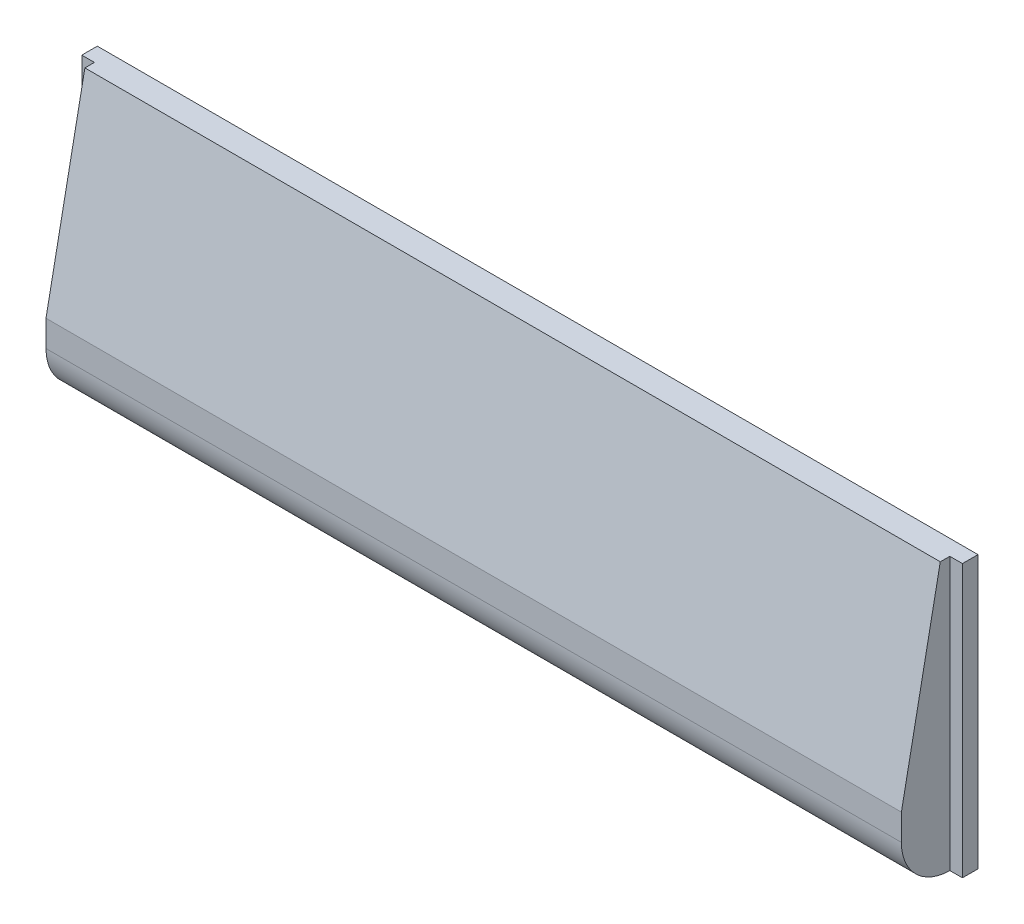
ISO-10303-21;
HEADER;
FILE_DESCRIPTION(('STEP AP214'),'2;1');
FILE_NAME('part.step','',(''),(''),'','','');
FILE_SCHEMA(('AUTOMOTIVE_DESIGN { 1 0 10303 214 1 1 1 1 }'));
ENDSEC;
DATA;
#1=APPLICATION_CONTEXT('core data for automotive mechanical design processes');
#2=APPLICATION_PROTOCOL_DEFINITION('international standard','automotive_design',2000,#1);
#3=PRODUCT_CONTEXT('',#1,'mechanical');
#4=PRODUCT('Part','Part','',(#3));
#5=PRODUCT_RELATED_PRODUCT_CATEGORY('part','',(#4));
#6=PRODUCT_DEFINITION_FORMATION('','',#4);
#7=PRODUCT_DEFINITION_CONTEXT('part definition',#1,'design');
#8=PRODUCT_DEFINITION('design','',#6,#7);
#9=PRODUCT_DEFINITION_SHAPE('','',#8);
#10=(LENGTH_UNIT() NAMED_UNIT(*) SI_UNIT(.MILLI.,.METRE.));
#11=(NAMED_UNIT(*) PLANE_ANGLE_UNIT() SI_UNIT($,.RADIAN.));
#12=(NAMED_UNIT(*) SI_UNIT($,.STERADIAN.) SOLID_ANGLE_UNIT());
#13=UNCERTAINTY_MEASURE_WITH_UNIT(LENGTH_MEASURE(1.E-05),#10,'distance_accuracy_value','');
#14=(GEOMETRIC_REPRESENTATION_CONTEXT(3) GLOBAL_UNCERTAINTY_ASSIGNED_CONTEXT((#13)) GLOBAL_UNIT_ASSIGNED_CONTEXT((#10,
#11,#12)) REPRESENTATION_CONTEXT('',''));
#15=CARTESIAN_POINT('',(0.,0.,0.));
#16=DIRECTION('',(0.,0.,1.));
#17=DIRECTION('',(1.,0.,0.));
#18=AXIS2_PLACEMENT_3D('',#15,#16,#17);
#19=CARTESIAN_POINT('',(-22.65,7.,0.8));
#20=DIRECTION('',(0.,-1.,0.));
#21=DIRECTION('',(0.,0.,-1.));
#22=AXIS2_PLACEMENT_3D('',#19,#20,#21);
#23=PLANE('',#22);
#24=DIRECTION('',(-1.,0.,0.));
#25=VECTOR('',#24,1.);
#26=CARTESIAN_POINT('',(35.,7.,1.29));
#27=LINE('',#26,#25);
#28=CARTESIAN_POINT('',(22.,7.,1.29));
#29=VERTEX_POINT('',#28);
#30=CARTESIAN_POINT('',(-22.,7.,1.29));
#31=VERTEX_POINT('',#30);
#32=EDGE_CURVE('E134',#29,#31,#27,.T.);
#33=ORIENTED_EDGE('',*,*,#32,.F.);
#34=DIRECTION('',(0.,0.,-1.));
#35=VECTOR('',#34,1.);
#36=CARTESIAN_POINT('',(22.,7.,5.8));
#37=LINE('',#36,#35);
#38=CARTESIAN_POINT('',(22.,7.,0.8));
#39=VERTEX_POINT('',#38);
#40=EDGE_CURVE('E148',#29,#39,#37,.T.);
#41=ORIENTED_EDGE('',*,*,#40,.T.);
#42=DIRECTION('',(-1.,0.,0.));
#43=VECTOR('',#42,1.);
#44=CARTESIAN_POINT('',(-22.65,7.,0.8));
#45=LINE('',#44,#43);
#46=CARTESIAN_POINT('',(22.65,7.,0.8));
#47=VERTEX_POINT('',#46);
#48=EDGE_CURVE('E156',#47,#39,#45,.T.);
#49=ORIENTED_EDGE('',*,*,#48,.F.);
#50=DIRECTION('',(0.,0.,-1.));
#51=VECTOR('',#50,1.);
#52=CARTESIAN_POINT('',(22.65,7.,0.8));
#53=LINE('',#52,#51);
#54=CARTESIAN_POINT('',(22.65,7.,0.));
#55=VERTEX_POINT('',#54);
#56=EDGE_CURVE('E11',#47,#55,#53,.T.);
#57=ORIENTED_EDGE('',*,*,#56,.T.);
#58=DIRECTION('',(-1.,0.,0.));
#59=VECTOR('',#58,1.);
#60=CARTESIAN_POINT('',(-22.65,7.,0.));
#61=LINE('',#60,#59);
#62=CARTESIAN_POINT('',(-22.65,7.,0.));
#63=VERTEX_POINT('',#62);
#64=EDGE_CURVE('E168',#55,#63,#61,.T.);
#65=ORIENTED_EDGE('',*,*,#64,.T.);
#66=DIRECTION('',(0.,0.,-1.));
#67=VECTOR('',#66,1.);
#68=CARTESIAN_POINT('',(-22.65,7.,0.8));
#69=LINE('',#68,#67);
#70=CARTESIAN_POINT('',(-22.65,7.,0.8));
#71=VERTEX_POINT('',#70);
#72=EDGE_CURVE('E47',#71,#63,#69,.T.);
#73=ORIENTED_EDGE('',*,*,#72,.F.);
#74=CARTESIAN_POINT('',(-22.,7.,0.8));
#75=VERTEX_POINT('',#74);
#76=EDGE_CURVE('E154',#75,#71,#45,.T.);
#77=ORIENTED_EDGE('',*,*,#76,.F.);
#78=DIRECTION('',(0.,0.,-1.));
#79=VECTOR('',#78,1.);
#80=CARTESIAN_POINT('',(-22.,7.,5.8));
#81=LINE('',#80,#79);
#82=EDGE_CURVE('E61',#31,#75,#81,.T.);
#83=ORIENTED_EDGE('',*,*,#82,.F.);
#84=EDGE_LOOP('',(#33,#41,#49,#57,#65,#73,#77,#83));
#85=FACE_BOUND('',#84,.T.);
#86=ADVANCED_FACE('F39',(#85),#23,.F.);
#87=CARTESIAN_POINT('',(0.,0.,0.8));
#88=DIRECTION('',(0.,0.,-1.));
#89=DIRECTION('',(-1.,0.,0.));
#90=AXIS2_PLACEMENT_3D('',#87,#88,#89);
#91=PLANE('',#90);
#92=DIRECTION('',(0.,1.,0.));
#93=VECTOR('',#92,1.);
#94=CARTESIAN_POINT('',(22.,-7.,0.8));
#95=LINE('',#94,#93);
#96=CARTESIAN_POINT('',(22.,-7.,0.8));
#97=VERTEX_POINT('',#96);
#98=EDGE_CURVE('E143',#97,#39,#95,.T.);
#99=ORIENTED_EDGE('',*,*,#98,.F.);
#100=DIRECTION('',(1.,0.,0.));
#101=VECTOR('',#100,1.);
#102=CARTESIAN_POINT('',(-22.65,-7.,0.8));
#103=LINE('',#102,#101);
#104=CARTESIAN_POINT('',(22.65,-7.,0.8));
#105=VERTEX_POINT('',#104);
#106=EDGE_CURVE('E161',#97,#105,#103,.T.);
#107=ORIENTED_EDGE('',*,*,#106,.T.);
#108=DIRECTION('',(0.,1.,0.));
#109=VECTOR('',#108,1.);
#110=CARTESIAN_POINT('',(22.65,-7.,0.8));
#111=LINE('',#110,#109);
#112=EDGE_CURVE('E151',#105,#47,#111,.T.);
#113=ORIENTED_EDGE('',*,*,#112,.T.);
#114=ORIENTED_EDGE('',*,*,#48,.T.);
#115=EDGE_LOOP('',(#99,#107,#113,#114));
#116=FACE_BOUND('',#115,.T.);
#117=ADVANCED_FACE('F200',(#116),#91,.F.);
#118=DIRECTION('',(0.,-1.,0.));
#119=VECTOR('',#118,1.);
#120=CARTESIAN_POINT('',(-22.,-7.,0.8));
#121=LINE('',#120,#119);
#122=CARTESIAN_POINT('',(-22.,-7.,0.8));
#123=VERTEX_POINT('',#122);
#124=EDGE_CURVE('E129',#75,#123,#121,.T.);
#125=ORIENTED_EDGE('',*,*,#124,.F.);
#126=ORIENTED_EDGE('',*,*,#76,.T.);
#127=DIRECTION('',(0.,-1.,0.));
#128=VECTOR('',#127,1.);
#129=CARTESIAN_POINT('',(-22.65,-7.,0.8));
#130=LINE('',#129,#128);
#131=CARTESIAN_POINT('',(-22.65,-7.,0.8));
#132=VERTEX_POINT('',#131);
#133=EDGE_CURVE('E159',#71,#132,#130,.T.);
#134=ORIENTED_EDGE('',*,*,#133,.T.);
#135=EDGE_CURVE('E162',#132,#123,#103,.T.);
#136=ORIENTED_EDGE('',*,*,#135,.T.);
#137=EDGE_LOOP('',(#125,#126,#134,#136));
#138=FACE_BOUND('',#137,.T.);
#139=ADVANCED_FACE('F202',(#138),#91,.F.);
#140=CARTESIAN_POINT('',(22.65,-7.,0.8));
#141=DIRECTION('',(-1.,0.,0.));
#142=DIRECTION('',(0.,0.,1.));
#143=AXIS2_PLACEMENT_3D('',#140,#141,#142);
#144=PLANE('',#143);
#145=DIRECTION('',(0.,1.,0.));
#146=VECTOR('',#145,1.);
#147=CARTESIAN_POINT('',(22.65,-7.,0.));
#148=LINE('',#147,#146);
#149=CARTESIAN_POINT('',(22.65,-7.,0.));
#150=VERTEX_POINT('',#149);
#151=EDGE_CURVE('E150',#150,#55,#148,.T.);
#152=ORIENTED_EDGE('',*,*,#151,.T.);
#153=ORIENTED_EDGE('',*,*,#56,.F.);
#154=ORIENTED_EDGE('',*,*,#112,.F.);
#155=DIRECTION('',(0.,0.,-1.));
#156=VECTOR('',#155,1.);
#157=CARTESIAN_POINT('',(22.65,-7.,0.8));
#158=LINE('',#157,#156);
#159=EDGE_CURVE('E165',#105,#150,#158,.T.);
#160=ORIENTED_EDGE('',*,*,#159,.T.);
#161=EDGE_LOOP('',(#152,#153,#154,#160));
#162=FACE_BOUND('',#161,.T.);
#163=ADVANCED_FACE('F41',(#162),#144,.F.);
#164=CARTESIAN_POINT('',(-22.65,-7.,0.8));
#165=DIRECTION('',(1.,0.,0.));
#166=DIRECTION('',(0.,0.,-1.));
#167=AXIS2_PLACEMENT_3D('',#164,#165,#166);
#168=PLANE('',#167);
#169=DIRECTION('',(0.,-1.,0.));
#170=VECTOR('',#169,1.);
#171=CARTESIAN_POINT('',(-22.65,-7.,0.));
#172=LINE('',#171,#170);
#173=CARTESIAN_POINT('',(-22.65,-7.,0.));
#174=VERTEX_POINT('',#173);
#175=EDGE_CURVE('E170',#63,#174,#172,.T.);
#176=ORIENTED_EDGE('',*,*,#175,.T.);
#177=DIRECTION('',(0.,0.,-1.));
#178=VECTOR('',#177,1.);
#179=CARTESIAN_POINT('',(-22.65,-7.,0.8));
#180=LINE('',#179,#178);
#181=EDGE_CURVE('E175',#132,#174,#180,.T.);
#182=ORIENTED_EDGE('',*,*,#181,.F.);
#183=ORIENTED_EDGE('',*,*,#133,.F.);
#184=ORIENTED_EDGE('',*,*,#72,.T.);
#185=EDGE_LOOP('',(#176,#182,#183,#184));
#186=FACE_BOUND('',#185,.T.);
#187=ADVANCED_FACE('F182',(#186),#168,.F.);
#188=CARTESIAN_POINT('',(-22.65,-7.,0.8));
#189=DIRECTION('',(0.,1.,0.));
#190=DIRECTION('',(0.,0.,1.));
#191=AXIS2_PLACEMENT_3D('',#188,#189,#190);
#192=PLANE('',#191);
#193=ORIENTED_EDGE('',*,*,#106,.F.);
#194=DIRECTION('',(-1.,0.,0.));
#195=VECTOR('',#194,1.);
#196=CARTESIAN_POINT('',(35.,-7.,0.8));
#197=LINE('',#196,#195);
#198=EDGE_CURVE('E121',#97,#123,#197,.T.);
#199=ORIENTED_EDGE('',*,*,#198,.T.);
#200=ORIENTED_EDGE('',*,*,#135,.F.);
#201=ORIENTED_EDGE('',*,*,#181,.T.);
#202=DIRECTION('',(1.,0.,0.));
#203=VECTOR('',#202,1.);
#204=CARTESIAN_POINT('',(-22.65,-7.,0.));
#205=LINE('',#204,#203);
#206=EDGE_CURVE('E155',#174,#150,#205,.T.);
#207=ORIENTED_EDGE('',*,*,#206,.T.);
#208=ORIENTED_EDGE('',*,*,#159,.F.);
#209=EDGE_LOOP('',(#193,#199,#200,#201,#207,#208));
#210=FACE_BOUND('',#209,.T.);
#211=ADVANCED_FACE('F193',(#210),#192,.F.);
#212=CARTESIAN_POINT('',(0.,0.,0.));
#213=DIRECTION('',(0.,0.,-1.));
#214=DIRECTION('',(-1.,0.,0.));
#215=AXIS2_PLACEMENT_3D('',#212,#213,#214);
#216=PLANE('',#215);
#217=ORIENTED_EDGE('',*,*,#151,.F.);
#218=ORIENTED_EDGE('',*,*,#206,.F.);
#219=ORIENTED_EDGE('',*,*,#175,.F.);
#220=ORIENTED_EDGE('',*,*,#64,.F.);
#221=EDGE_LOOP('',(#217,#218,#219,#220));
#222=FACE_BOUND('',#221,.T.);
#223=ADVANCED_FACE('F189',(#222),#216,.T.);
#224=CARTESIAN_POINT('',(22.,-7.,5.8));
#225=DIRECTION('',(-1.,0.,0.));
#226=DIRECTION('',(0.,0.,1.));
#227=AXIS2_PLACEMENT_3D('',#224,#225,#226);
#228=PLANE('',#227);
#229=ORIENTED_EDGE('',*,*,#40,.F.);
#230=DIRECTION('',(0.,-0.981134385151089,0.193326972443564));
#231=VECTOR('',#230,1.);
#232=CARTESIAN_POINT('',(22.,-7.33220117265061,4.11407904879815));
#233=LINE('',#232,#231);
#234=CARTESIAN_POINT('',(22.,-3.15,3.29));
#235=VERTEX_POINT('',#234);
#236=EDGE_CURVE('E140',#29,#235,#233,.T.);
#237=ORIENTED_EDGE('',*,*,#236,.T.);
#238=DIRECTION('',(0.,-1.,0.));
#239=VECTOR('',#238,1.);
#240=CARTESIAN_POINT('',(22.,-7.,3.29));
#241=LINE('',#240,#239);
#242=CARTESIAN_POINT('',(22.,-4.5,3.29));
#243=VERTEX_POINT('',#242);
#244=EDGE_CURVE('E136',#235,#243,#241,.T.);
#245=ORIENTED_EDGE('',*,*,#244,.T.);
#246=CARTESIAN_POINT('',(22.,-4.5,0.789979919678716));
#247=DIRECTION('',(-1.,0.,0.));
#248=DIRECTION('',(0.,0.,1.));
#249=AXIS2_PLACEMENT_3D('',#246,#247,#248);
#250=CIRCLE('',#249,2.50002008032128);
#251=EDGE_CURVE('E118',#243,#97,#250,.F.);
#252=ORIENTED_EDGE('',*,*,#251,.T.);
#253=ORIENTED_EDGE('',*,*,#98,.T.);
#254=EDGE_LOOP('',(#229,#237,#245,#252,#253));
#255=FACE_BOUND('',#254,.T.);
#256=ADVANCED_FACE('F206',(#255),#228,.F.);
#257=CARTESIAN_POINT('',(-22.,-7.,5.8));
#258=DIRECTION('',(1.,0.,0.));
#259=DIRECTION('',(0.,0.,-1.));
#260=AXIS2_PLACEMENT_3D('',#257,#258,#259);
#261=PLANE('',#260);
#262=DIRECTION('',(0.,-1.,0.));
#263=VECTOR('',#262,1.);
#264=CARTESIAN_POINT('',(-22.,-3.15,3.29));
#265=LINE('',#264,#263);
#266=CARTESIAN_POINT('',(-22.,-3.15,3.29));
#267=VERTEX_POINT('',#266);
#268=CARTESIAN_POINT('',(-22.,-4.5,3.29));
#269=VERTEX_POINT('',#268);
#270=EDGE_CURVE('E125',#267,#269,#265,.T.);
#271=ORIENTED_EDGE('',*,*,#270,.F.);
#272=DIRECTION('',(0.,-0.981134385151089,0.193326972443564));
#273=VECTOR('',#272,1.);
#274=CARTESIAN_POINT('',(-22.,7.,1.29));
#275=LINE('',#274,#273);
#276=EDGE_CURVE('E54',#31,#267,#275,.T.);
#277=ORIENTED_EDGE('',*,*,#276,.F.);
#278=ORIENTED_EDGE('',*,*,#82,.T.);
#279=ORIENTED_EDGE('',*,*,#124,.T.);
#280=CARTESIAN_POINT('',(-22.,-4.5,0.789979919678716));
#281=DIRECTION('',(1.,0.,0.));
#282=DIRECTION('',(0.,0.,-1.));
#283=AXIS2_PLACEMENT_3D('',#280,#281,#282);
#284=CIRCLE('',#283,2.50002008032128);
#285=EDGE_CURVE('E115',#269,#123,#284,.T.);
#286=ORIENTED_EDGE('',*,*,#285,.F.);
#287=EDGE_LOOP('',(#271,#277,#278,#279,#286));
#288=FACE_BOUND('',#287,.T.);
#289=ADVANCED_FACE('F128',(#288),#261,.F.);
#290=CARTESIAN_POINT('',(35.,7.,1.29));
#291=DIRECTION('',(0.,-0.193326972443564,-0.981134385151089));
#292=DIRECTION('',(0.,0.981134385151089,-0.193326972443564));
#293=AXIS2_PLACEMENT_3D('',#290,#291,#292);
#294=PLANE('',#293);
#295=ORIENTED_EDGE('',*,*,#32,.T.);
#296=ORIENTED_EDGE('',*,*,#276,.T.);
#297=DIRECTION('',(-1.,0.,0.));
#298=VECTOR('',#297,1.);
#299=CARTESIAN_POINT('',(35.,-3.15,3.29));
#300=LINE('',#299,#298);
#301=EDGE_CURVE('E122',#235,#267,#300,.T.);
#302=ORIENTED_EDGE('',*,*,#301,.F.);
#303=ORIENTED_EDGE('',*,*,#236,.F.);
#304=EDGE_LOOP('',(#295,#296,#302,#303));
#305=FACE_BOUND('',#304,.T.);
#306=ADVANCED_FACE('F207',(#305),#294,.F.);
#307=CARTESIAN_POINT('',(35.,-4.5,0.789979919678716));
#308=DIRECTION('',(-1.,0.,0.));
#309=DIRECTION('',(0.,0.,1.));
#310=AXIS2_PLACEMENT_3D('',#307,#308,#309);
#311=CYLINDRICAL_SURFACE('',#310,2.50002008032128);
#312=DIRECTION('',(-1.,0.,0.));
#313=VECTOR('',#312,1.);
#314=CARTESIAN_POINT('',(35.,-4.5,3.29));
#315=LINE('',#314,#313);
#316=EDGE_CURVE('E111',#243,#269,#315,.T.);
#317=ORIENTED_EDGE('',*,*,#316,.T.);
#318=ORIENTED_EDGE('',*,*,#285,.T.);
#319=ORIENTED_EDGE('',*,*,#198,.F.);
#320=ORIENTED_EDGE('',*,*,#251,.F.);
#321=EDGE_LOOP('',(#317,#318,#319,#320));
#322=FACE_BOUND('',#321,.T.);
#323=ADVANCED_FACE('F113',(#322),#311,.T.);
#324=CARTESIAN_POINT('',(35.,-3.15,3.29));
#325=DIRECTION('',(0.,0.,-1.));
#326=DIRECTION('',(-1.,0.,0.));
#327=AXIS2_PLACEMENT_3D('',#324,#325,#326);
#328=PLANE('',#327);
#329=ORIENTED_EDGE('',*,*,#301,.T.);
#330=ORIENTED_EDGE('',*,*,#270,.T.);
#331=ORIENTED_EDGE('',*,*,#316,.F.);
#332=ORIENTED_EDGE('',*,*,#244,.F.);
#333=EDGE_LOOP('',(#329,#330,#331,#332));
#334=FACE_BOUND('',#333,.T.);
#335=ADVANCED_FACE('F126',(#334),#328,.F.);
#336=CLOSED_SHELL('',(#86,#117,#139,#163,#187,#211,#223,#256,#289,#306,#323,#335));
#337=MANIFOLD_SOLID_BREP('B2',#336);
#338=ADVANCED_BREP_SHAPE_REPRESENTATION('',(#18,#337),#14);
#339=SHAPE_DEFINITION_REPRESENTATION(#9,#338);
ENDSEC;
END-ISO-10303-21;
